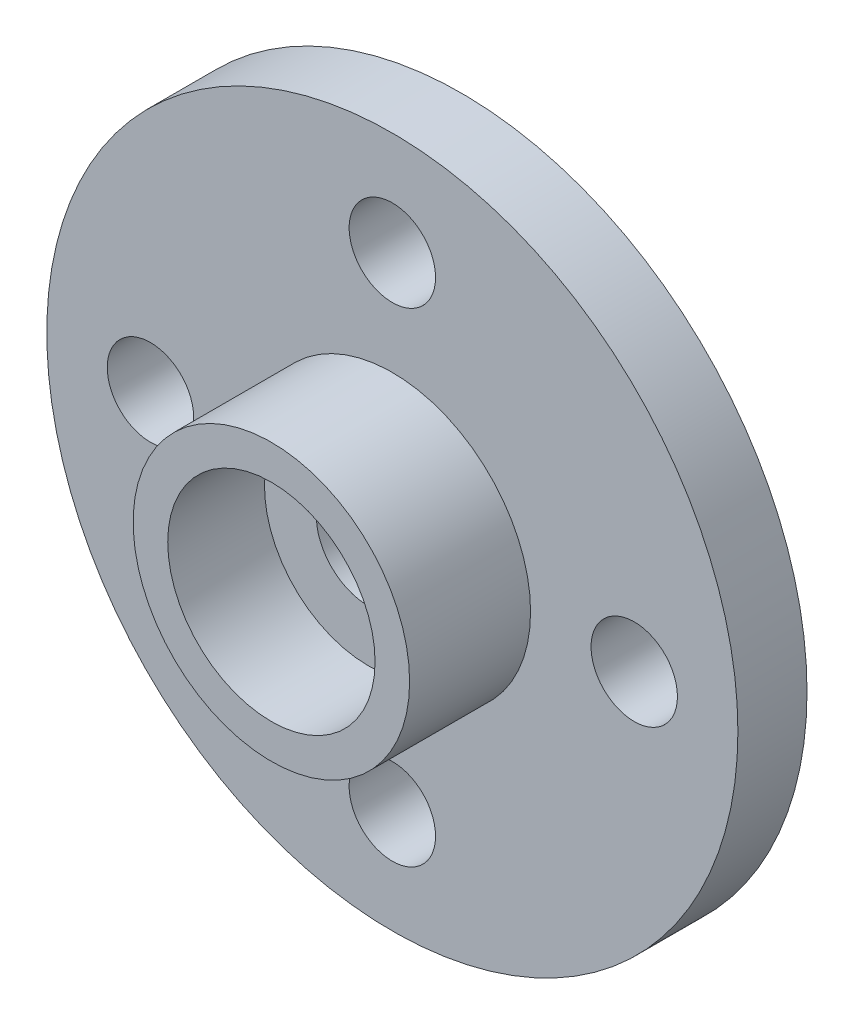
ISO-10303-21;
HEADER;
FILE_DESCRIPTION(('STEP AP214'),'2;1');
FILE_NAME('part.step','',(''),(''),'','','');
FILE_SCHEMA(('AUTOMOTIVE_DESIGN { 1 0 10303 214 1 1 1 1 }'));
ENDSEC;
DATA;
#1=APPLICATION_CONTEXT('core data for automotive mechanical design processes');
#2=APPLICATION_PROTOCOL_DEFINITION('international standard','automotive_design',2000,#1);
#3=PRODUCT_CONTEXT('',#1,'mechanical');
#4=PRODUCT('Part','Part','',(#3));
#5=PRODUCT_RELATED_PRODUCT_CATEGORY('part','',(#4));
#6=PRODUCT_DEFINITION_FORMATION('','',#4);
#7=PRODUCT_DEFINITION_CONTEXT('part definition',#1,'design');
#8=PRODUCT_DEFINITION('design','',#6,#7);
#9=PRODUCT_DEFINITION_SHAPE('','',#8);
#10=(LENGTH_UNIT() NAMED_UNIT(*) SI_UNIT(.MILLI.,.METRE.));
#11=(NAMED_UNIT(*) PLANE_ANGLE_UNIT() SI_UNIT($,.RADIAN.));
#12=(NAMED_UNIT(*) SI_UNIT($,.STERADIAN.) SOLID_ANGLE_UNIT());
#13=UNCERTAINTY_MEASURE_WITH_UNIT(LENGTH_MEASURE(1.E-05),#10,'distance_accuracy_value','');
#14=(GEOMETRIC_REPRESENTATION_CONTEXT(3) GLOBAL_UNCERTAINTY_ASSIGNED_CONTEXT((#13)) GLOBAL_UNIT_ASSIGNED_CONTEXT((#10,
#11,#12)) REPRESENTATION_CONTEXT('',''));
#15=CARTESIAN_POINT('',(0.,0.,0.));
#16=DIRECTION('',(0.,0.,1.));
#17=DIRECTION('',(1.,0.,0.));
#18=AXIS2_PLACEMENT_3D('',#15,#16,#17);
#19=CARTESIAN_POINT('',(0.,0.,2.));
#20=DIRECTION('',(0.,0.,1.));
#21=DIRECTION('',(1.,0.,0.));
#22=AXIS2_PLACEMENT_3D('',#19,#20,#21);
#23=PLANE('',#22);
#24=CARTESIAN_POINT('',(-7.,0.,2.));
#25=DIRECTION('',(0.,0.,1.));
#26=DIRECTION('',(1.,0.,0.));
#27=AXIS2_PLACEMENT_3D('',#24,#25,#26);
#28=CIRCLE('',#27,1.24999999999999);
#29=CARTESIAN_POINT('',(-5.75000000000001,0.,2.));
#30=VERTEX_POINT('',#29);
#31=EDGE_CURVE('E99',#30,#30,#28,.T.);
#32=ORIENTED_EDGE('',*,*,#31,.F.);
#33=EDGE_LOOP('',(#32));
#34=FACE_BOUND('',#33,.T.);
#35=CARTESIAN_POINT('',(0.,7.,2.));
#36=DIRECTION('',(0.,0.,1.));
#37=DIRECTION('',(1.,0.,0.));
#38=AXIS2_PLACEMENT_3D('',#35,#36,#37);
#39=CIRCLE('',#38,1.24999999999999);
#40=CARTESIAN_POINT('',(1.24999999999999,7.,2.));
#41=VERTEX_POINT('',#40);
#42=EDGE_CURVE('E91',#41,#41,#39,.T.);
#43=ORIENTED_EDGE('',*,*,#42,.F.);
#44=EDGE_LOOP('',(#43));
#45=FACE_BOUND('',#44,.T.);
#46=CARTESIAN_POINT('',(7.,0.,2.));
#47=DIRECTION('',(0.,0.,1.));
#48=DIRECTION('',(1.,0.,0.));
#49=AXIS2_PLACEMENT_3D('',#46,#47,#48);
#50=CIRCLE('',#49,1.24999999999999);
#51=CARTESIAN_POINT('',(8.24999999999999,0.,2.));
#52=VERTEX_POINT('',#51);
#53=EDGE_CURVE('E83',#52,#52,#50,.T.);
#54=ORIENTED_EDGE('',*,*,#53,.F.);
#55=EDGE_LOOP('',(#54));
#56=FACE_BOUND('',#55,.T.);
#57=CARTESIAN_POINT('',(0.,-7.,2.));
#58=DIRECTION('',(0.,0.,1.));
#59=DIRECTION('',(1.,0.,0.));
#60=AXIS2_PLACEMENT_3D('',#57,#58,#59);
#61=CIRCLE('',#60,1.24999999999999);
#62=CARTESIAN_POINT('',(1.24999999999999,-7.,2.));
#63=VERTEX_POINT('',#62);
#64=EDGE_CURVE('E75',#63,#63,#61,.T.);
#65=ORIENTED_EDGE('',*,*,#64,.F.);
#66=EDGE_LOOP('',(#65));
#67=FACE_BOUND('',#66,.T.);
#68=CARTESIAN_POINT('',(0.,0.,2.));
#69=DIRECTION('',(0.,0.,1.));
#70=DIRECTION('',(1.,0.,0.));
#71=AXIS2_PLACEMENT_3D('',#68,#69,#70);
#72=CIRCLE('',#71,10.);
#73=CARTESIAN_POINT('',(10.,0.,2.));
#74=VERTEX_POINT('',#73);
#75=EDGE_CURVE('E47',#74,#74,#72,.T.);
#76=ORIENTED_EDGE('',*,*,#75,.T.);
#77=EDGE_LOOP('',(#76));
#78=FACE_BOUND('',#77,.T.);
#79=CARTESIAN_POINT('',(0.,0.,2.));
#80=DIRECTION('',(0.,0.,1.));
#81=DIRECTION('',(1.,0.,0.));
#82=AXIS2_PLACEMENT_3D('',#79,#80,#81);
#83=CIRCLE('',#82,4.);
#84=CARTESIAN_POINT('',(4.,0.,2.));
#85=VERTEX_POINT('',#84);
#86=EDGE_CURVE('E60',#85,#85,#83,.T.);
#87=ORIENTED_EDGE('',*,*,#86,.F.);
#88=EDGE_LOOP('',(#87));
#89=FACE_BOUND('',#88,.T.);
#90=ADVANCED_FACE('F39',(#34,#45,#56,#67,#78,#89),#23,.T.);
#91=CARTESIAN_POINT('',(0.,0.,0.));
#92=DIRECTION('',(0.,0.,1.));
#93=DIRECTION('',(1.,0.,0.));
#94=AXIS2_PLACEMENT_3D('',#91,#92,#93);
#95=PLANE('',#94);
#96=CARTESIAN_POINT('',(-7.,0.,0.));
#97=DIRECTION('',(0.,0.,1.));
#98=DIRECTION('',(1.,0.,0.));
#99=AXIS2_PLACEMENT_3D('',#96,#97,#98);
#100=CIRCLE('',#99,1.25);
#101=CARTESIAN_POINT('',(-5.75,0.,0.));
#102=VERTEX_POINT('',#101);
#103=EDGE_CURVE('E95',#102,#102,#100,.T.);
#104=ORIENTED_EDGE('',*,*,#103,.T.);
#105=EDGE_LOOP('',(#104));
#106=FACE_BOUND('',#105,.T.);
#107=CARTESIAN_POINT('',(0.,7.,0.));
#108=DIRECTION('',(0.,0.,1.));
#109=DIRECTION('',(1.,0.,0.));
#110=AXIS2_PLACEMENT_3D('',#107,#108,#109);
#111=CIRCLE('',#110,1.25);
#112=CARTESIAN_POINT('',(1.25,7.,0.));
#113=VERTEX_POINT('',#112);
#114=EDGE_CURVE('E87',#113,#113,#111,.T.);
#115=ORIENTED_EDGE('',*,*,#114,.T.);
#116=EDGE_LOOP('',(#115));
#117=FACE_BOUND('',#116,.T.);
#118=CARTESIAN_POINT('',(7.,0.,0.));
#119=DIRECTION('',(0.,0.,1.));
#120=DIRECTION('',(1.,0.,0.));
#121=AXIS2_PLACEMENT_3D('',#118,#119,#120);
#122=CIRCLE('',#121,1.25);
#123=CARTESIAN_POINT('',(8.25,0.,0.));
#124=VERTEX_POINT('',#123);
#125=EDGE_CURVE('E79',#124,#124,#122,.T.);
#126=ORIENTED_EDGE('',*,*,#125,.T.);
#127=EDGE_LOOP('',(#126));
#128=FACE_BOUND('',#127,.T.);
#129=CARTESIAN_POINT('',(0.,-7.,0.));
#130=DIRECTION('',(0.,0.,1.));
#131=DIRECTION('',(1.,0.,0.));
#132=AXIS2_PLACEMENT_3D('',#129,#130,#131);
#133=CIRCLE('',#132,1.25);
#134=CARTESIAN_POINT('',(1.25,-7.,0.));
#135=VERTEX_POINT('',#134);
#136=EDGE_CURVE('E71',#135,#135,#133,.T.);
#137=ORIENTED_EDGE('',*,*,#136,.T.);
#138=EDGE_LOOP('',(#137));
#139=FACE_BOUND('',#138,.T.);
#140=CARTESIAN_POINT('',(0.,0.,0.));
#141=DIRECTION('',(0.,0.,1.));
#142=DIRECTION('',(1.,0.,0.));
#143=AXIS2_PLACEMENT_3D('',#140,#141,#142);
#144=CIRCLE('',#143,10.);
#145=CARTESIAN_POINT('',(10.,0.,0.));
#146=VERTEX_POINT('',#145);
#147=EDGE_CURVE('E52',#146,#146,#144,.T.);
#148=ORIENTED_EDGE('',*,*,#147,.F.);
#149=EDGE_LOOP('',(#148));
#150=FACE_BOUND('',#149,.T.);
#151=ADVANCED_FACE('F126',(#106,#117,#128,#139,#150),#95,.F.);
#152=CARTESIAN_POINT('',(0.,0.,2.));
#153=DIRECTION('',(0.,0.,-1.));
#154=DIRECTION('',(-1.,0.,0.));
#155=AXIS2_PLACEMENT_3D('',#152,#153,#154);
#156=CYLINDRICAL_SURFACE('',#155,10.);
#157=ORIENTED_EDGE('',*,*,#75,.F.);
#158=EDGE_LOOP('',(#157));
#159=FACE_BOUND('',#158,.T.);
#160=ORIENTED_EDGE('',*,*,#147,.T.);
#161=EDGE_LOOP('',(#160));
#162=FACE_BOUND('',#161,.T.);
#163=ADVANCED_FACE('F41',(#159,#162),#156,.T.);
#164=CARTESIAN_POINT('',(0.,0.,2.));
#165=DIRECTION('',(0.,0.,-1.));
#166=DIRECTION('',(-1.,0.,0.));
#167=AXIS2_PLACEMENT_3D('',#164,#165,#166);
#168=CYLINDRICAL_SURFACE('',#167,3.);
#169=CARTESIAN_POINT('',(0.,0.,2.7));
#170=DIRECTION('',(0.,0.,1.));
#171=DIRECTION('',(0.,-1.,0.));
#172=AXIS2_PLACEMENT_3D('',#169,#170,#171);
#173=CIRCLE('',#172,3.);
#174=CARTESIAN_POINT('',(0.,-3.,2.7));
#175=VERTEX_POINT('',#174);
#176=EDGE_CURVE('E10',#175,#175,#173,.T.);
#177=ORIENTED_EDGE('',*,*,#176,.F.);
#178=EDGE_LOOP('',(#177));
#179=FACE_BOUND('',#178,.T.);
#180=CARTESIAN_POINT('',(0.,0.,5.5));
#181=DIRECTION('',(0.,0.,1.));
#182=DIRECTION('',(1.,0.,0.));
#183=AXIS2_PLACEMENT_3D('',#180,#181,#182);
#184=CIRCLE('',#183,3.);
#185=CARTESIAN_POINT('',(3.,0.,5.5));
#186=VERTEX_POINT('',#185);
#187=EDGE_CURVE('E64',#186,#186,#184,.T.);
#188=ORIENTED_EDGE('',*,*,#187,.T.);
#189=EDGE_LOOP('',(#188));
#190=FACE_BOUND('',#189,.T.);
#191=ADVANCED_FACE('F136',(#179,#190),#168,.F.);
#192=CARTESIAN_POINT('',(0.,0.,5.5));
#193=DIRECTION('',(0.,0.,1.));
#194=DIRECTION('',(1.,0.,0.));
#195=AXIS2_PLACEMENT_3D('',#192,#193,#194);
#196=PLANE('',#195);
#197=CARTESIAN_POINT('',(0.,0.,5.5));
#198=DIRECTION('',(0.,0.,1.));
#199=DIRECTION('',(1.,0.,0.));
#200=AXIS2_PLACEMENT_3D('',#197,#198,#199);
#201=CIRCLE('',#200,4.);
#202=CARTESIAN_POINT('',(4.,0.,5.5));
#203=VERTEX_POINT('',#202);
#204=EDGE_CURVE('E58',#203,#203,#201,.T.);
#205=ORIENTED_EDGE('',*,*,#204,.T.);
#206=EDGE_LOOP('',(#205));
#207=FACE_BOUND('',#206,.T.);
#208=ORIENTED_EDGE('',*,*,#187,.F.);
#209=EDGE_LOOP('',(#208));
#210=FACE_BOUND('',#209,.T.);
#211=ADVANCED_FACE('F139',(#207,#210),#196,.T.);
#212=CARTESIAN_POINT('',(0.,0.,5.5));
#213=DIRECTION('',(0.,0.,-1.));
#214=DIRECTION('',(-1.,0.,0.));
#215=AXIS2_PLACEMENT_3D('',#212,#213,#214);
#216=CYLINDRICAL_SURFACE('',#215,4.);
#217=ORIENTED_EDGE('',*,*,#204,.F.);
#218=EDGE_LOOP('',(#217));
#219=FACE_BOUND('',#218,.T.);
#220=ORIENTED_EDGE('',*,*,#86,.T.);
#221=EDGE_LOOP('',(#220));
#222=FACE_BOUND('',#221,.T.);
#223=ADVANCED_FACE('F141',(#219,#222),#216,.T.);
#224=CARTESIAN_POINT('',(0.,-7.,2.));
#225=DIRECTION('',(0.,0.,1.));
#226=DIRECTION('',(1.,0.,0.));
#227=AXIS2_PLACEMENT_3D('',#224,#225,#226);
#228=CYLINDRICAL_SURFACE('',#227,1.24999999999999);
#229=ORIENTED_EDGE('',*,*,#136,.F.);
#230=EDGE_LOOP('',(#229));
#231=FACE_BOUND('',#230,.T.);
#232=ORIENTED_EDGE('',*,*,#64,.T.);
#233=EDGE_LOOP('',(#232));
#234=FACE_BOUND('',#233,.T.);
#235=ADVANCED_FACE('F144',(#231,#234),#228,.F.);
#236=CARTESIAN_POINT('',(7.,0.,2.));
#237=DIRECTION('',(0.,0.,1.));
#238=DIRECTION('',(1.,0.,0.));
#239=AXIS2_PLACEMENT_3D('',#236,#237,#238);
#240=CYLINDRICAL_SURFACE('',#239,1.24999999999999);
#241=ORIENTED_EDGE('',*,*,#125,.F.);
#242=EDGE_LOOP('',(#241));
#243=FACE_BOUND('',#242,.T.);
#244=ORIENTED_EDGE('',*,*,#53,.T.);
#245=EDGE_LOOP('',(#244));
#246=FACE_BOUND('',#245,.T.);
#247=ADVANCED_FACE('F151',(#243,#246),#240,.F.);
#248=CARTESIAN_POINT('',(0.,7.,2.));
#249=DIRECTION('',(0.,0.,1.));
#250=DIRECTION('',(1.,0.,0.));
#251=AXIS2_PLACEMENT_3D('',#248,#249,#250);
#252=CYLINDRICAL_SURFACE('',#251,1.24999999999999);
#253=ORIENTED_EDGE('',*,*,#114,.F.);
#254=EDGE_LOOP('',(#253));
#255=FACE_BOUND('',#254,.T.);
#256=ORIENTED_EDGE('',*,*,#42,.T.);
#257=EDGE_LOOP('',(#256));
#258=FACE_BOUND('',#257,.T.);
#259=ADVANCED_FACE('F155',(#255,#258),#252,.F.);
#260=CARTESIAN_POINT('',(-7.,0.,2.));
#261=DIRECTION('',(0.,0.,1.));
#262=DIRECTION('',(1.,0.,0.));
#263=AXIS2_PLACEMENT_3D('',#260,#261,#262);
#264=CYLINDRICAL_SURFACE('',#263,1.24999999999999);
#265=ORIENTED_EDGE('',*,*,#103,.F.);
#266=EDGE_LOOP('',(#265));
#267=FACE_BOUND('',#266,.T.);
#268=ORIENTED_EDGE('',*,*,#31,.T.);
#269=EDGE_LOOP('',(#268));
#270=FACE_BOUND('',#269,.T.);
#271=ADVANCED_FACE('F159',(#267,#270),#264,.F.);
#272=CARTESIAN_POINT('',(0.,0.,0.));
#273=DIRECTION('',(0.,0.,-1.));
#274=DIRECTION('',(0.,1.,0.));
#275=AXIS2_PLACEMENT_3D('',#272,#273,#274);
#276=CYLINDRICAL_SURFACE('',#275,1.5);
#277=CARTESIAN_POINT('',(0.,0.,1.4));
#278=DIRECTION('',(0.,0.,-1.));
#279=DIRECTION('',(0.,1.,0.));
#280=AXIS2_PLACEMENT_3D('',#277,#278,#279);
#281=CIRCLE('',#280,1.5);
#282=CARTESIAN_POINT('',(0.,1.5,1.4));
#283=VERTEX_POINT('',#282);
#284=EDGE_CURVE('E107',#283,#283,#281,.T.);
#285=ORIENTED_EDGE('',*,*,#284,.T.);
#286=EDGE_LOOP('',(#285));
#287=FACE_BOUND('',#286,.T.);
#288=CARTESIAN_POINT('',(0.,0.,2.7));
#289=DIRECTION('',(0.,0.,-1.));
#290=DIRECTION('',(0.,1.,0.));
#291=AXIS2_PLACEMENT_3D('',#288,#289,#290);
#292=CIRCLE('',#291,1.5);
#293=CARTESIAN_POINT('',(0.,1.5,2.7));
#294=VERTEX_POINT('',#293);
#295=EDGE_CURVE('E103',#294,#294,#292,.T.);
#296=ORIENTED_EDGE('',*,*,#295,.F.);
#297=EDGE_LOOP('',(#296));
#298=FACE_BOUND('',#297,.T.);
#299=ADVANCED_FACE('F112',(#287,#298),#276,.F.);
#300=CARTESIAN_POINT('',(0.,1.5,2.7));
#301=DIRECTION('',(0.,0.,1.));
#302=DIRECTION('',(0.,-1.,0.));
#303=AXIS2_PLACEMENT_3D('',#300,#301,#302);
#304=PLANE('',#303);
#305=ORIENTED_EDGE('',*,*,#295,.T.);
#306=EDGE_LOOP('',(#305));
#307=FACE_BOUND('',#306,.T.);
#308=ORIENTED_EDGE('',*,*,#176,.T.);
#309=EDGE_LOOP('',(#308));
#310=FACE_BOUND('',#309,.T.);
#311=ADVANCED_FACE('F117',(#307,#310),#304,.T.);
#312=CARTESIAN_POINT('',(0.,0.,1.4));
#313=DIRECTION('',(0.,0.,-1.));
#314=DIRECTION('',(0.,1.,0.));
#315=AXIS2_PLACEMENT_3D('',#312,#313,#314);
#316=PLANE('',#315);
#317=ORIENTED_EDGE('',*,*,#284,.F.);
#318=EDGE_LOOP('',(#317));
#319=FACE_BOUND('',#318,.T.);
#320=ADVANCED_FACE('F115',(#319),#316,.F.);
#321=CLOSED_SHELL('',(#90,#151,#163,#191,#211,#223,#235,#247,#259,#271,#299,#311,#320));
#322=MANIFOLD_SOLID_BREP('B2',#321);
#323=ADVANCED_BREP_SHAPE_REPRESENTATION('',(#18,#322),#14);
#324=SHAPE_DEFINITION_REPRESENTATION(#9,#323);
ENDSEC;
END-ISO-10303-21;
